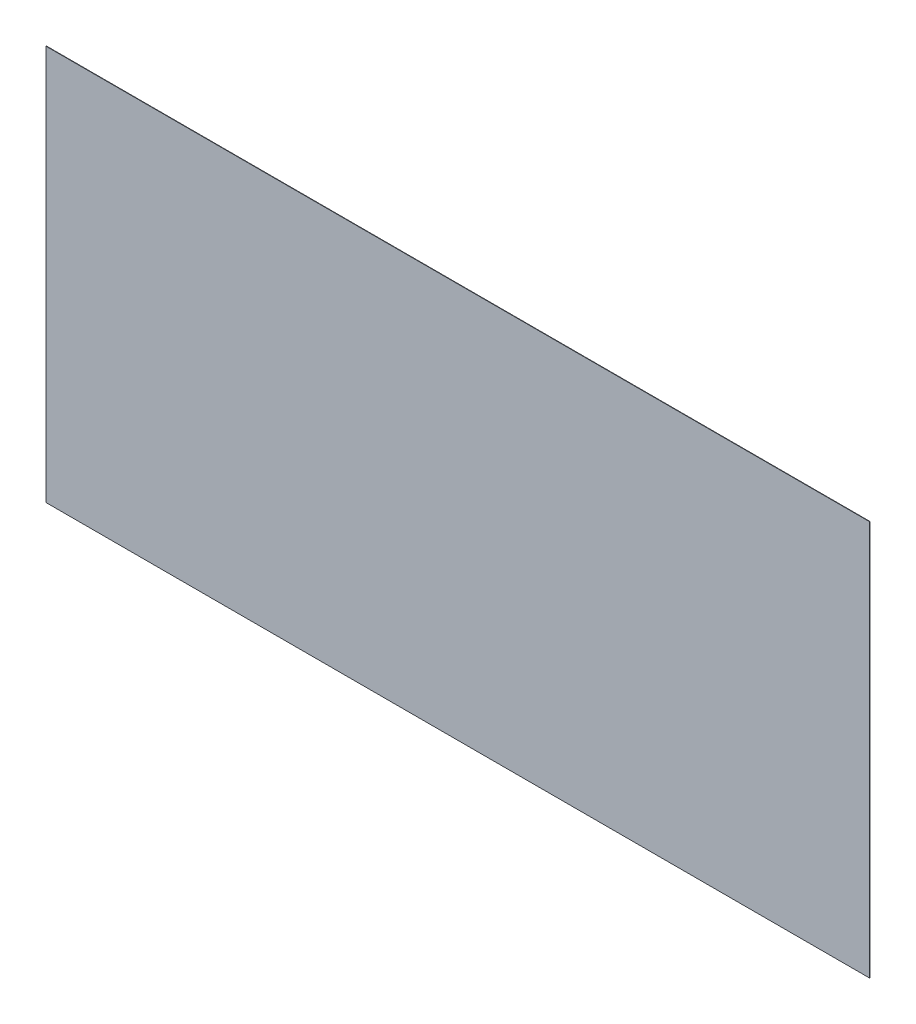
ISO-10303-21;
HEADER;
FILE_DESCRIPTION(('STEP AP214'),'2;1');
FILE_NAME('part.step','',(''),(''),'','','');
FILE_SCHEMA(('AUTOMOTIVE_DESIGN { 1 0 10303 214 1 1 1 1 }'));
ENDSEC;
DATA;
#1=APPLICATION_CONTEXT('core data for automotive mechanical design processes');
#2=APPLICATION_PROTOCOL_DEFINITION('international standard','automotive_design',2000,#1);
#3=PRODUCT_CONTEXT('',#1,'mechanical');
#4=PRODUCT('Part','Part','',(#3));
#5=PRODUCT_RELATED_PRODUCT_CATEGORY('part','',(#4));
#6=PRODUCT_DEFINITION_FORMATION('','',#4);
#7=PRODUCT_DEFINITION_CONTEXT('part definition',#1,'design');
#8=PRODUCT_DEFINITION('design','',#6,#7);
#9=PRODUCT_DEFINITION_SHAPE('','',#8);
#10=(LENGTH_UNIT() NAMED_UNIT(*) SI_UNIT(.MILLI.,.METRE.));
#11=(NAMED_UNIT(*) PLANE_ANGLE_UNIT() SI_UNIT($,.RADIAN.));
#12=(NAMED_UNIT(*) SI_UNIT($,.STERADIAN.) SOLID_ANGLE_UNIT());
#13=UNCERTAINTY_MEASURE_WITH_UNIT(LENGTH_MEASURE(1.E-05),#10,'distance_accuracy_value','');
#14=(GEOMETRIC_REPRESENTATION_CONTEXT(3) GLOBAL_UNCERTAINTY_ASSIGNED_CONTEXT((#13)) GLOBAL_UNIT_ASSIGNED_CONTEXT((#10,
#11,#12)) REPRESENTATION_CONTEXT('',''));
#15=CARTESIAN_POINT('',(0.,0.,0.));
#16=DIRECTION('',(0.,0.,1.));
#17=DIRECTION('',(1.,0.,0.));
#18=AXIS2_PLACEMENT_3D('',#15,#16,#17);
#19=CARTESIAN_POINT('',(-400000.,-60.0000000000023,151.327));
#20=DIRECTION('',(0.,-1.,0.));
#21=DIRECTION('',(0.,0.,-1.));
#22=AXIS2_PLACEMENT_3D('',#19,#20,#21);
#23=PLANE('',#22);
#24=DIRECTION('',(-1.,0.,0.));
#25=VECTOR('',#24,1.);
#26=CARTESIAN_POINT('',(-400000.,-60.0000000000023,151.2));
#27=LINE('',#26,#25);
#28=CARTESIAN_POINT('',(125.000000000023,-60.0000000000023,151.2));
#29=VERTEX_POINT('',#28);
#30=CARTESIAN_POINT('',(-125.000000000011,-60.0000000000023,151.2));
#31=VERTEX_POINT('',#30);
#32=EDGE_CURVE('E117',#29,#31,#27,.T.);
#33=ORIENTED_EDGE('',*,*,#32,.F.);
#34=DIRECTION('',(0.,0.,-1.));
#35=VECTOR('',#34,1.);
#36=CARTESIAN_POINT('',(125.000000000023,-60.0000000000023,151.327));
#37=LINE('',#36,#35);
#38=CARTESIAN_POINT('',(125.000000000023,-60.0000000000023,151.327));
#39=VERTEX_POINT('',#38);
#40=EDGE_CURVE('E11',#39,#29,#37,.T.);
#41=ORIENTED_EDGE('',*,*,#40,.F.);
#42=DIRECTION('',(-1.,0.,0.));
#43=VECTOR('',#42,1.);
#44=CARTESIAN_POINT('',(-400000.,-60.0000000000023,151.327));
#45=LINE('',#44,#43);
#46=CARTESIAN_POINT('',(-125.000000000011,-60.0000000000023,151.327));
#47=VERTEX_POINT('',#46);
#48=EDGE_CURVE('E109',#39,#47,#45,.T.);
#49=ORIENTED_EDGE('',*,*,#48,.T.);
#50=DIRECTION('',(0.,0.,-1.));
#51=VECTOR('',#50,1.);
#52=CARTESIAN_POINT('',(-125.000000000011,-60.0000000000023,151.327));
#53=LINE('',#52,#51);
#54=EDGE_CURVE('E50',#47,#31,#53,.T.);
#55=ORIENTED_EDGE('',*,*,#54,.T.);
#56=EDGE_LOOP('',(#33,#41,#49,#55));
#57=FACE_BOUND('',#56,.T.);
#58=ADVANCED_FACE('F47',(#57),#23,.T.);
#59=CARTESIAN_POINT('',(125.000000000057,-291534.,151.327));
#60=DIRECTION('',(1.,0.,0.));
#61=DIRECTION('',(0.,1.,0.));
#62=AXIS2_PLACEMENT_3D('',#59,#60,#61);
#63=PLANE('',#62);
#64=DIRECTION('',(0.,-1.,0.));
#65=VECTOR('',#64,1.);
#66=CARTESIAN_POINT('',(125.000000000057,-291534.,151.2));
#67=LINE('',#66,#65);
#68=CARTESIAN_POINT('',(125.000000000023,60.0000000000023,151.2));
#69=VERTEX_POINT('',#68);
#70=EDGE_CURVE('E112',#69,#29,#67,.T.);
#71=ORIENTED_EDGE('',*,*,#70,.F.);
#72=DIRECTION('',(0.,0.,-1.));
#73=VECTOR('',#72,1.);
#74=CARTESIAN_POINT('',(125.000000000023,60.0000000000023,151.327));
#75=LINE('',#74,#73);
#76=CARTESIAN_POINT('',(125.000000000023,60.0000000000023,151.327));
#77=VERTEX_POINT('',#76);
#78=EDGE_CURVE('E57',#77,#69,#75,.T.);
#79=ORIENTED_EDGE('',*,*,#78,.F.);
#80=DIRECTION('',(0.,-1.,0.));
#81=VECTOR('',#80,1.);
#82=CARTESIAN_POINT('',(125.000000000057,-291534.,151.327));
#83=LINE('',#82,#81);
#84=EDGE_CURVE('E104',#77,#39,#83,.T.);
#85=ORIENTED_EDGE('',*,*,#84,.T.);
#86=ORIENTED_EDGE('',*,*,#40,.T.);
#87=EDGE_LOOP('',(#71,#79,#85,#86));
#88=FACE_BOUND('',#87,.T.);
#89=ADVANCED_FACE('F133',(#88),#63,.T.);
#90=CARTESIAN_POINT('',(-400000.,60.0000000000023,151.327));
#91=DIRECTION('',(0.,1.,0.));
#92=DIRECTION('',(0.,0.,1.));
#93=AXIS2_PLACEMENT_3D('',#90,#91,#92);
#94=PLANE('',#93);
#95=DIRECTION('',(1.,0.,0.));
#96=VECTOR('',#95,1.);
#97=CARTESIAN_POINT('',(-400000.,60.0000000000023,151.2));
#98=LINE('',#97,#96);
#99=CARTESIAN_POINT('',(-125.,60.0000000000023,151.2));
#100=VERTEX_POINT('',#99);
#101=EDGE_CURVE('E98',#100,#69,#98,.T.);
#102=ORIENTED_EDGE('',*,*,#101,.F.);
#103=DIRECTION('',(0.,0.,-1.));
#104=VECTOR('',#103,1.);
#105=CARTESIAN_POINT('',(-125.,60.0000000000023,151.327));
#106=LINE('',#105,#104);
#107=CARTESIAN_POINT('',(-125.,60.0000000000023,151.327));
#108=VERTEX_POINT('',#107);
#109=EDGE_CURVE('E93',#108,#100,#106,.T.);
#110=ORIENTED_EDGE('',*,*,#109,.F.);
#111=DIRECTION('',(1.,0.,0.));
#112=VECTOR('',#111,1.);
#113=CARTESIAN_POINT('',(-400000.,60.0000000000023,151.327));
#114=LINE('',#113,#112);
#115=EDGE_CURVE('E96',#108,#77,#114,.T.);
#116=ORIENTED_EDGE('',*,*,#115,.T.);
#117=ORIENTED_EDGE('',*,*,#78,.T.);
#118=EDGE_LOOP('',(#102,#110,#116,#117));
#119=FACE_BOUND('',#118,.T.);
#120=ADVANCED_FACE('F95',(#119),#94,.T.);
#121=CARTESIAN_POINT('',(-124.999999999943,-291534.,151.327));
#122=DIRECTION('',(-1.,0.,0.));
#123=DIRECTION('',(0.,-1.,0.));
#124=AXIS2_PLACEMENT_3D('',#121,#122,#123);
#125=PLANE('',#124);
#126=DIRECTION('',(0.,1.,0.));
#127=VECTOR('',#126,1.);
#128=CARTESIAN_POINT('',(-124.999999999943,-291534.,151.2));
#129=LINE('',#128,#127);
#130=EDGE_CURVE('E121',#31,#100,#129,.T.);
#131=ORIENTED_EDGE('',*,*,#130,.F.);
#132=ORIENTED_EDGE('',*,*,#54,.F.);
#133=DIRECTION('',(0.,1.,0.));
#134=VECTOR('',#133,1.);
#135=CARTESIAN_POINT('',(-124.999999999943,-291534.,151.327));
#136=LINE('',#135,#134);
#137=EDGE_CURVE('E103',#47,#108,#136,.T.);
#138=ORIENTED_EDGE('',*,*,#137,.T.);
#139=ORIENTED_EDGE('',*,*,#109,.T.);
#140=EDGE_LOOP('',(#131,#132,#138,#139));
#141=FACE_BOUND('',#140,.T.);
#142=ADVANCED_FACE('F107',(#141),#125,.T.);
#143=CARTESIAN_POINT('',(0.,0.,151.327));
#144=DIRECTION('',(0.,0.,-1.));
#145=DIRECTION('',(-1.,0.,0.));
#146=AXIS2_PLACEMENT_3D('',#143,#144,#145);
#147=PLANE('',#146);
#148=ORIENTED_EDGE('',*,*,#48,.F.);
#149=ORIENTED_EDGE('',*,*,#84,.F.);
#150=ORIENTED_EDGE('',*,*,#115,.F.);
#151=ORIENTED_EDGE('',*,*,#137,.F.);
#152=EDGE_LOOP('',(#148,#149,#150,#151));
#153=FACE_BOUND('',#152,.T.);
#154=ADVANCED_FACE('F102',(#153),#147,.F.);
#155=CARTESIAN_POINT('',(0.,0.,151.2));
#156=DIRECTION('',(0.,0.,-1.));
#157=DIRECTION('',(-1.,0.,0.));
#158=AXIS2_PLACEMENT_3D('',#155,#156,#157);
#159=PLANE('',#158);
#160=ORIENTED_EDGE('',*,*,#32,.T.);
#161=ORIENTED_EDGE('',*,*,#130,.T.);
#162=ORIENTED_EDGE('',*,*,#101,.T.);
#163=ORIENTED_EDGE('',*,*,#70,.T.);
#164=EDGE_LOOP('',(#160,#161,#162,#163));
#165=FACE_BOUND('',#164,.T.);
#166=ADVANCED_FACE('F132',(#165),#159,.T.);
#167=CLOSED_SHELL('',(#58,#89,#120,#142,#154,#166));
#168=MANIFOLD_SOLID_BREP('B2',#167);
#169=ADVANCED_BREP_SHAPE_REPRESENTATION('',(#18,#168),#14);
#170=SHAPE_DEFINITION_REPRESENTATION(#9,#169);
ENDSEC;
END-ISO-10303-21;
